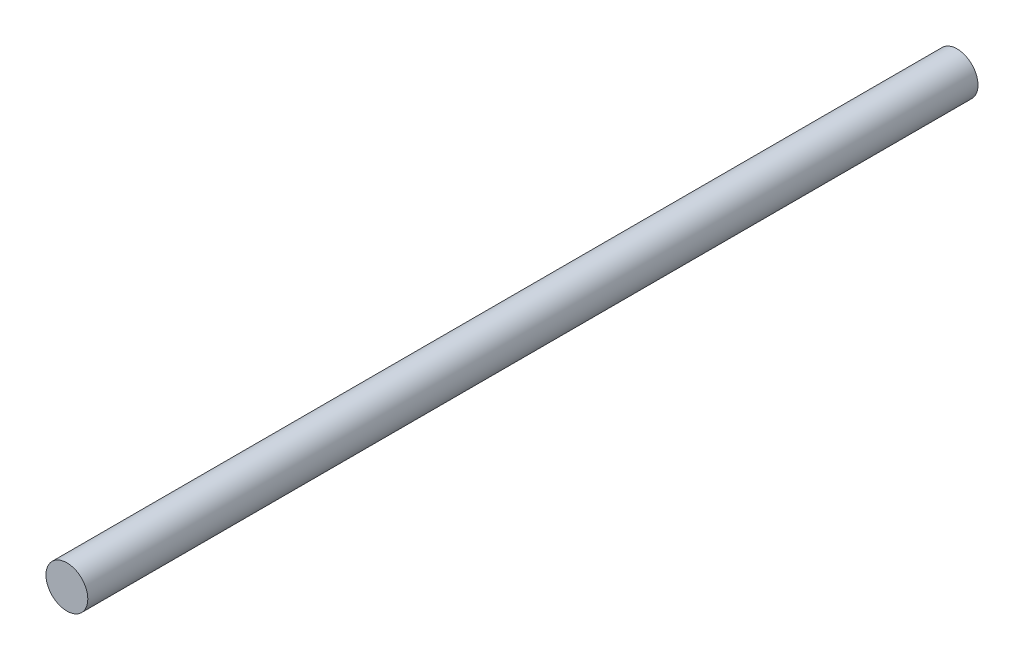
ISO-10303-21;
HEADER;
FILE_DESCRIPTION(('STEP AP214'),'2;1');
FILE_NAME('part.step','',(''),(''),'','','');
FILE_SCHEMA(('AUTOMOTIVE_DESIGN { 1 0 10303 214 1 1 1 1 }'));
ENDSEC;
DATA;
#1=APPLICATION_CONTEXT('core data for automotive mechanical design processes');
#2=APPLICATION_PROTOCOL_DEFINITION('international standard','automotive_design',2000,#1);
#3=PRODUCT_CONTEXT('',#1,'mechanical');
#4=PRODUCT('Part','Part','',(#3));
#5=PRODUCT_RELATED_PRODUCT_CATEGORY('part','',(#4));
#6=PRODUCT_DEFINITION_FORMATION('','',#4);
#7=PRODUCT_DEFINITION_CONTEXT('part definition',#1,'design');
#8=PRODUCT_DEFINITION('design','',#6,#7);
#9=PRODUCT_DEFINITION_SHAPE('','',#8);
#10=(LENGTH_UNIT() NAMED_UNIT(*) SI_UNIT(.MILLI.,.METRE.));
#11=(NAMED_UNIT(*) PLANE_ANGLE_UNIT() SI_UNIT($,.RADIAN.));
#12=(NAMED_UNIT(*) SI_UNIT($,.STERADIAN.) SOLID_ANGLE_UNIT());
#13=UNCERTAINTY_MEASURE_WITH_UNIT(LENGTH_MEASURE(1.E-05),#10,'distance_accuracy_value','');
#14=(GEOMETRIC_REPRESENTATION_CONTEXT(3) GLOBAL_UNCERTAINTY_ASSIGNED_CONTEXT((#13)) GLOBAL_UNIT_ASSIGNED_CONTEXT((#10,
#11,#12)) REPRESENTATION_CONTEXT('',''));
#15=CARTESIAN_POINT('',(0.,0.,0.));
#16=DIRECTION('',(0.,0.,1.));
#17=DIRECTION('',(1.,0.,0.));
#18=AXIS2_PLACEMENT_3D('',#15,#16,#17);
#19=CARTESIAN_POINT('',(0.,0.,44.23964083));
#20=DIRECTION('',(0.,0.,-1.));
#21=DIRECTION('',(-1.,0.,0.));
#22=AXIS2_PLACEMENT_3D('',#19,#20,#21);
#23=CYLINDRICAL_SURFACE('',#22,1.04);
#24=CARTESIAN_POINT('',(0.,0.,44.23964083));
#25=DIRECTION('',(0.,0.,1.));
#26=DIRECTION('',(1.,0.,0.));
#27=AXIS2_PLACEMENT_3D('',#24,#25,#26);
#28=CIRCLE('',#27,1.04);
#29=CARTESIAN_POINT('',(1.04,0.,44.23964083));
#30=VERTEX_POINT('',#29);
#31=EDGE_CURVE('E10',#30,#30,#28,.T.);
#32=ORIENTED_EDGE('',*,*,#31,.F.);
#33=EDGE_LOOP('',(#32));
#34=FACE_BOUND('',#33,.T.);
#35=CARTESIAN_POINT('',(0.,0.,0.));
#36=DIRECTION('',(0.,0.,1.));
#37=DIRECTION('',(1.,0.,0.));
#38=AXIS2_PLACEMENT_3D('',#35,#36,#37);
#39=CIRCLE('',#38,1.04);
#40=CARTESIAN_POINT('',(1.04,0.,0.));
#41=VERTEX_POINT('',#40);
#42=EDGE_CURVE('E46',#41,#41,#39,.T.);
#43=ORIENTED_EDGE('',*,*,#42,.T.);
#44=EDGE_LOOP('',(#43));
#45=FACE_BOUND('',#44,.T.);
#46=ADVANCED_FACE('F43',(#34,#45),#23,.T.);
#47=CARTESIAN_POINT('',(0.,0.,44.23964083));
#48=DIRECTION('',(0.,0.,1.));
#49=DIRECTION('',(1.,0.,0.));
#50=AXIS2_PLACEMENT_3D('',#47,#48,#49);
#51=PLANE('',#50);
#52=ORIENTED_EDGE('',*,*,#31,.T.);
#53=EDGE_LOOP('',(#52));
#54=FACE_BOUND('',#53,.T.);
#55=ADVANCED_FACE('F60',(#54),#51,.T.);
#56=CARTESIAN_POINT('',(0.,0.,0.));
#57=DIRECTION('',(0.,0.,1.));
#58=DIRECTION('',(1.,0.,0.));
#59=AXIS2_PLACEMENT_3D('',#56,#57,#58);
#60=PLANE('',#59);
#61=ORIENTED_EDGE('',*,*,#42,.F.);
#62=EDGE_LOOP('',(#61));
#63=FACE_BOUND('',#62,.T.);
#64=ADVANCED_FACE('F58',(#63),#60,.F.);
#65=CLOSED_SHELL('',(#46,#55,#64));
#66=MANIFOLD_SOLID_BREP('B2',#65);
#67=ADVANCED_BREP_SHAPE_REPRESENTATION('',(#18,#66),#14);
#68=SHAPE_DEFINITION_REPRESENTATION(#9,#67);
ENDSEC;
END-ISO-10303-21;
